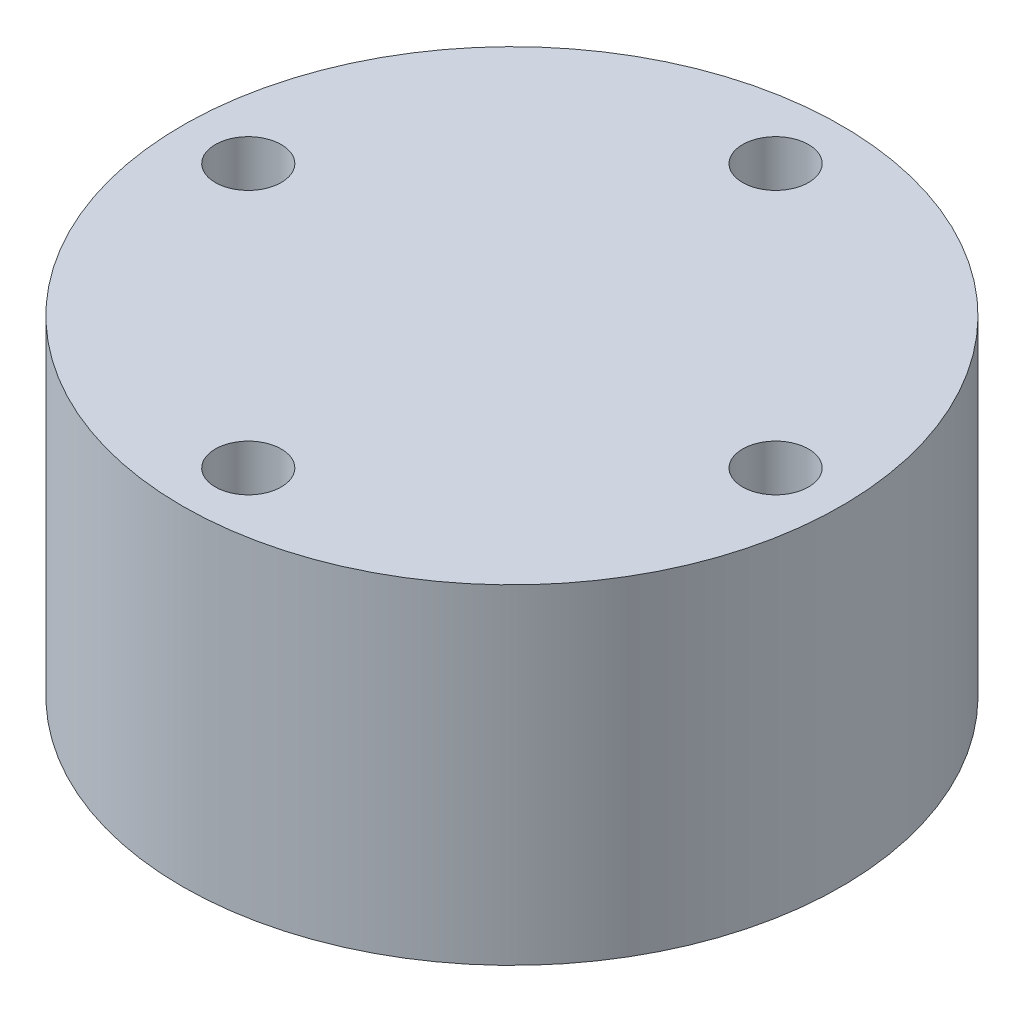
ISO-10303-21;
HEADER;
FILE_DESCRIPTION(('STEP AP214'),'2;1');
FILE_NAME('part.step','',(''),(''),'','','');
FILE_SCHEMA(('AUTOMOTIVE_DESIGN { 1 0 10303 214 1 1 1 1 }'));
ENDSEC;
DATA;
#1=APPLICATION_CONTEXT('core data for automotive mechanical design processes');
#2=APPLICATION_PROTOCOL_DEFINITION('international standard','automotive_design',2000,#1);
#3=PRODUCT_CONTEXT('',#1,'mechanical');
#4=PRODUCT('Part','Part','',(#3));
#5=PRODUCT_RELATED_PRODUCT_CATEGORY('part','',(#4));
#6=PRODUCT_DEFINITION_FORMATION('','',#4);
#7=PRODUCT_DEFINITION_CONTEXT('part definition',#1,'design');
#8=PRODUCT_DEFINITION('design','',#6,#7);
#9=PRODUCT_DEFINITION_SHAPE('','',#8);
#10=(LENGTH_UNIT() NAMED_UNIT(*) SI_UNIT(.MILLI.,.METRE.));
#11=(NAMED_UNIT(*) PLANE_ANGLE_UNIT() SI_UNIT($,.RADIAN.));
#12=(NAMED_UNIT(*) SI_UNIT($,.STERADIAN.) SOLID_ANGLE_UNIT());
#13=UNCERTAINTY_MEASURE_WITH_UNIT(LENGTH_MEASURE(1.E-05),#10,'distance_accuracy_value','');
#14=(GEOMETRIC_REPRESENTATION_CONTEXT(3) GLOBAL_UNCERTAINTY_ASSIGNED_CONTEXT((#13)) GLOBAL_UNIT_ASSIGNED_CONTEXT((#10,
#11,#12)) REPRESENTATION_CONTEXT('',''));
#15=CARTESIAN_POINT('',(0.,0.,0.));
#16=DIRECTION('',(0.,0.,1.));
#17=DIRECTION('',(1.,0.,0.));
#18=AXIS2_PLACEMENT_3D('',#15,#16,#17);
#19=CARTESIAN_POINT('',(-4.,5.,0.));
#20=DIRECTION('',(0.,-1.,0.));
#21=DIRECTION('',(0.,0.,-1.));
#22=AXIS2_PLACEMENT_3D('',#19,#20,#21);
#23=CYLINDRICAL_SURFACE('',#22,0.5);
#24=CARTESIAN_POINT('',(-4.,5.,0.));
#25=DIRECTION('',(0.,1.,0.));
#26=DIRECTION('',(0.,0.,1.));
#27=AXIS2_PLACEMENT_3D('',#24,#25,#26);
#28=CIRCLE('',#27,0.5);
#29=CARTESIAN_POINT('',(-4.,5.,0.5));
#30=VERTEX_POINT('',#29);
#31=EDGE_CURVE('E54',#30,#30,#28,.T.);
#32=ORIENTED_EDGE('',*,*,#31,.T.);
#33=EDGE_LOOP('',(#32));
#34=FACE_BOUND('',#33,.T.);
#35=CARTESIAN_POINT('',(-4.,0.,0.));
#36=DIRECTION('',(0.,1.,0.));
#37=DIRECTION('',(0.,0.,1.));
#38=AXIS2_PLACEMENT_3D('',#35,#36,#37);
#39=CIRCLE('',#38,0.5);
#40=CARTESIAN_POINT('',(-4.,0.,0.5));
#41=VERTEX_POINT('',#40);
#42=EDGE_CURVE('E75',#41,#41,#39,.T.);
#43=ORIENTED_EDGE('',*,*,#42,.F.);
#44=EDGE_LOOP('',(#43));
#45=FACE_BOUND('',#44,.T.);
#46=ADVANCED_FACE('F45',(#34,#45),#23,.F.);
#47=CARTESIAN_POINT('',(0.,5.,-4.));
#48=DIRECTION('',(0.,-1.,0.));
#49=DIRECTION('',(0.,0.,-1.));
#50=AXIS2_PLACEMENT_3D('',#47,#48,#49);
#51=CYLINDRICAL_SURFACE('',#50,0.5);
#52=CARTESIAN_POINT('',(0.,5.,-4.));
#53=DIRECTION('',(0.,1.,0.));
#54=DIRECTION('',(0.,0.,1.));
#55=AXIS2_PLACEMENT_3D('',#52,#53,#54);
#56=CIRCLE('',#55,0.5);
#57=CARTESIAN_POINT('',(0.,5.,-3.5));
#58=VERTEX_POINT('',#57);
#59=EDGE_CURVE('E60',#58,#58,#56,.T.);
#60=ORIENTED_EDGE('',*,*,#59,.T.);
#61=EDGE_LOOP('',(#60));
#62=FACE_BOUND('',#61,.T.);
#63=CARTESIAN_POINT('',(0.,0.,-4.));
#64=DIRECTION('',(0.,1.,0.));
#65=DIRECTION('',(0.,0.,1.));
#66=AXIS2_PLACEMENT_3D('',#63,#64,#65);
#67=CIRCLE('',#66,0.5);
#68=CARTESIAN_POINT('',(0.,0.,-3.5));
#69=VERTEX_POINT('',#68);
#70=EDGE_CURVE('E72',#69,#69,#67,.T.);
#71=ORIENTED_EDGE('',*,*,#70,.F.);
#72=EDGE_LOOP('',(#71));
#73=FACE_BOUND('',#72,.T.);
#74=ADVANCED_FACE('F98',(#62,#73),#51,.F.);
#75=CARTESIAN_POINT('',(4.,5.,0.));
#76=DIRECTION('',(0.,-1.,0.));
#77=DIRECTION('',(0.,0.,-1.));
#78=AXIS2_PLACEMENT_3D('',#75,#76,#77);
#79=CYLINDRICAL_SURFACE('',#78,0.500000000000001);
#80=CARTESIAN_POINT('',(4.,5.,0.));
#81=DIRECTION('',(0.,1.,0.));
#82=DIRECTION('',(0.,0.,1.));
#83=AXIS2_PLACEMENT_3D('',#80,#81,#82);
#84=CIRCLE('',#83,0.500000000000001);
#85=CARTESIAN_POINT('',(4.,5.,0.500000000000001));
#86=VERTEX_POINT('',#85);
#87=EDGE_CURVE('E87',#86,#86,#84,.T.);
#88=ORIENTED_EDGE('',*,*,#87,.T.);
#89=EDGE_LOOP('',(#88));
#90=FACE_BOUND('',#89,.T.);
#91=CARTESIAN_POINT('',(4.,0.,0.));
#92=DIRECTION('',(0.,1.,0.));
#93=DIRECTION('',(0.,0.,1.));
#94=AXIS2_PLACEMENT_3D('',#91,#92,#93);
#95=CIRCLE('',#94,0.500000000000001);
#96=CARTESIAN_POINT('',(4.,0.,0.500000000000001));
#97=VERTEX_POINT('',#96);
#98=EDGE_CURVE('E68',#97,#97,#95,.T.);
#99=ORIENTED_EDGE('',*,*,#98,.F.);
#100=EDGE_LOOP('',(#99));
#101=FACE_BOUND('',#100,.T.);
#102=ADVANCED_FACE('F116',(#90,#101),#79,.F.);
#103=CARTESIAN_POINT('',(0.,5.,4.));
#104=DIRECTION('',(0.,-1.,0.));
#105=DIRECTION('',(0.,0.,-1.));
#106=AXIS2_PLACEMENT_3D('',#103,#104,#105);
#107=CYLINDRICAL_SURFACE('',#106,0.5);
#108=CARTESIAN_POINT('',(0.,5.,4.));
#109=DIRECTION('',(0.,1.,0.));
#110=DIRECTION('',(0.,0.,1.));
#111=AXIS2_PLACEMENT_3D('',#108,#109,#110);
#112=CIRCLE('',#111,0.5);
#113=CARTESIAN_POINT('',(0.,5.,4.5));
#114=VERTEX_POINT('',#113);
#115=EDGE_CURVE('E82',#114,#114,#112,.T.);
#116=ORIENTED_EDGE('',*,*,#115,.T.);
#117=EDGE_LOOP('',(#116));
#118=FACE_BOUND('',#117,.T.);
#119=CARTESIAN_POINT('',(0.,0.,4.));
#120=DIRECTION('',(0.,1.,0.));
#121=DIRECTION('',(0.,0.,1.));
#122=AXIS2_PLACEMENT_3D('',#119,#120,#121);
#123=CIRCLE('',#122,0.5);
#124=CARTESIAN_POINT('',(0.,0.,4.5));
#125=VERTEX_POINT('',#124);
#126=EDGE_CURVE('E64',#125,#125,#123,.T.);
#127=ORIENTED_EDGE('',*,*,#126,.F.);
#128=EDGE_LOOP('',(#127));
#129=FACE_BOUND('',#128,.T.);
#130=ADVANCED_FACE('F47',(#118,#129),#107,.F.);
#131=CARTESIAN_POINT('',(0.,5.,0.));
#132=DIRECTION('',(0.,-1.,0.));
#133=DIRECTION('',(0.,0.,-1.));
#134=AXIS2_PLACEMENT_3D('',#131,#132,#133);
#135=CYLINDRICAL_SURFACE('',#134,5.);
#136=CARTESIAN_POINT('',(0.,5.,0.));
#137=DIRECTION('',(0.,1.,0.));
#138=DIRECTION('',(0.,0.,1.));
#139=AXIS2_PLACEMENT_3D('',#136,#137,#138);
#140=CIRCLE('',#139,5.);
#141=CARTESIAN_POINT('',(0.,5.,5.));
#142=VERTEX_POINT('',#141);
#143=EDGE_CURVE('E10',#142,#142,#140,.T.);
#144=ORIENTED_EDGE('',*,*,#143,.F.);
#145=EDGE_LOOP('',(#144));
#146=FACE_BOUND('',#145,.T.);
#147=CARTESIAN_POINT('',(0.,0.,0.));
#148=DIRECTION('',(0.,1.,0.));
#149=DIRECTION('',(0.,0.,1.));
#150=AXIS2_PLACEMENT_3D('',#147,#148,#149);
#151=CIRCLE('',#150,5.);
#152=CARTESIAN_POINT('',(0.,0.,5.));
#153=VERTEX_POINT('',#152);
#154=EDGE_CURVE('E49',#153,#153,#151,.T.);
#155=ORIENTED_EDGE('',*,*,#154,.T.);
#156=EDGE_LOOP('',(#155));
#157=FACE_BOUND('',#156,.T.);
#158=ADVANCED_FACE('F105',(#146,#157),#135,.T.);
#159=CARTESIAN_POINT('',(0.,5.,0.));
#160=DIRECTION('',(0.,1.,0.));
#161=DIRECTION('',(0.,0.,1.));
#162=AXIS2_PLACEMENT_3D('',#159,#160,#161);
#163=PLANE('',#162);
#164=ORIENTED_EDGE('',*,*,#115,.F.);
#165=EDGE_LOOP('',(#164));
#166=FACE_BOUND('',#165,.T.);
#167=ORIENTED_EDGE('',*,*,#87,.F.);
#168=EDGE_LOOP('',(#167));
#169=FACE_BOUND('',#168,.T.);
#170=ORIENTED_EDGE('',*,*,#59,.F.);
#171=EDGE_LOOP('',(#170));
#172=FACE_BOUND('',#171,.T.);
#173=ORIENTED_EDGE('',*,*,#31,.F.);
#174=EDGE_LOOP('',(#173));
#175=FACE_BOUND('',#174,.T.);
#176=ORIENTED_EDGE('',*,*,#143,.T.);
#177=EDGE_LOOP('',(#176));
#178=FACE_BOUND('',#177,.T.);
#179=ADVANCED_FACE('F101',(#166,#169,#172,#175,#178),#163,.T.);
#180=CARTESIAN_POINT('',(0.,0.,0.));
#181=DIRECTION('',(0.,1.,0.));
#182=DIRECTION('',(0.,0.,1.));
#183=AXIS2_PLACEMENT_3D('',#180,#181,#182);
#184=PLANE('',#183);
#185=ORIENTED_EDGE('',*,*,#126,.T.);
#186=EDGE_LOOP('',(#185));
#187=FACE_BOUND('',#186,.T.);
#188=ORIENTED_EDGE('',*,*,#98,.T.);
#189=EDGE_LOOP('',(#188));
#190=FACE_BOUND('',#189,.T.);
#191=ORIENTED_EDGE('',*,*,#70,.T.);
#192=EDGE_LOOP('',(#191));
#193=FACE_BOUND('',#192,.T.);
#194=ORIENTED_EDGE('',*,*,#42,.T.);
#195=EDGE_LOOP('',(#194));
#196=FACE_BOUND('',#195,.T.);
#197=ORIENTED_EDGE('',*,*,#154,.F.);
#198=EDGE_LOOP('',(#197));
#199=FACE_BOUND('',#198,.T.);
#200=ADVANCED_FACE('F104',(#187,#190,#193,#196,#199),#184,.F.);
#201=CLOSED_SHELL('',(#46,#74,#102,#130,#158,#179,#200));
#202=MANIFOLD_SOLID_BREP('B2',#201);
#203=ADVANCED_BREP_SHAPE_REPRESENTATION('',(#18,#202),#14);
#204=SHAPE_DEFINITION_REPRESENTATION(#9,#203);
ENDSEC;
END-ISO-10303-21;
